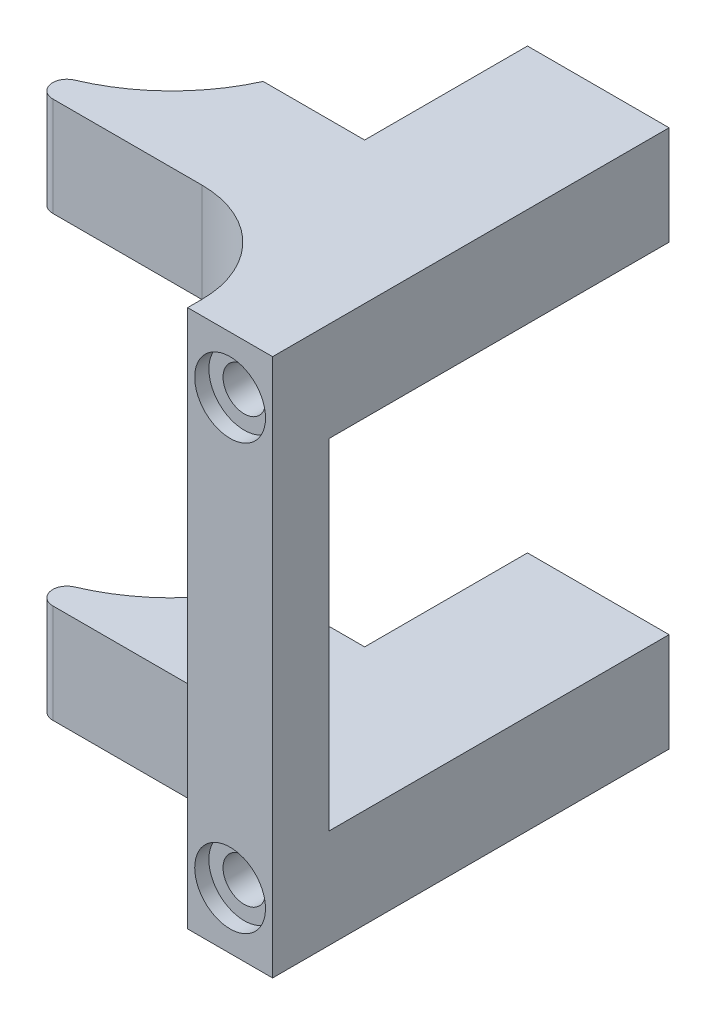
ISO-10303-21;
HEADER;
FILE_DESCRIPTION(('STEP AP214'),'2;1');
FILE_NAME('part.step','',(''),(''),'','','');
FILE_SCHEMA(('AUTOMOTIVE_DESIGN { 1 0 10303 214 1 1 1 1 }'));
ENDSEC;
DATA;
#1=APPLICATION_CONTEXT('core data for automotive mechanical design processes');
#2=APPLICATION_PROTOCOL_DEFINITION('international standard','automotive_design',2000,#1);
#3=PRODUCT_CONTEXT('',#1,'mechanical');
#4=PRODUCT('Part','Part','',(#3));
#5=PRODUCT_RELATED_PRODUCT_CATEGORY('part','',(#4));
#6=PRODUCT_DEFINITION_FORMATION('','',#4);
#7=PRODUCT_DEFINITION_CONTEXT('part definition',#1,'design');
#8=PRODUCT_DEFINITION('design','',#6,#7);
#9=PRODUCT_DEFINITION_SHAPE('','',#8);
#10=(LENGTH_UNIT() NAMED_UNIT(*) SI_UNIT(.MILLI.,.METRE.));
#11=(NAMED_UNIT(*) PLANE_ANGLE_UNIT() SI_UNIT($,.RADIAN.));
#12=(NAMED_UNIT(*) SI_UNIT($,.STERADIAN.) SOLID_ANGLE_UNIT());
#13=UNCERTAINTY_MEASURE_WITH_UNIT(LENGTH_MEASURE(1.E-05),#10,'distance_accuracy_value','');
#14=(GEOMETRIC_REPRESENTATION_CONTEXT(3) GLOBAL_UNCERTAINTY_ASSIGNED_CONTEXT((#13)) GLOBAL_UNIT_ASSIGNED_CONTEXT((#10,
#11,#12)) REPRESENTATION_CONTEXT('',''));
#15=CARTESIAN_POINT('',(0.,0.,0.));
#16=DIRECTION('',(0.,0.,1.));
#17=DIRECTION('',(1.,0.,0.));
#18=AXIS2_PLACEMENT_3D('',#15,#16,#17);
#19=CARTESIAN_POINT('',(2.,34.,-10.));
#20=DIRECTION('',(0.,0.,1.));
#21=DIRECTION('',(1.,0.,0.));
#22=AXIS2_PLACEMENT_3D('',#19,#20,#21);
#23=CYLINDRICAL_SURFACE('',#22,1.5);
#24=CARTESIAN_POINT('',(2.,34.,-10.));
#25=DIRECTION('',(0.,0.,1.));
#26=DIRECTION('',(-1.,0.,0.));
#27=AXIS2_PLACEMENT_3D('',#24,#25,#26);
#28=CIRCLE('',#27,1.5);
#29=CARTESIAN_POINT('',(0.499999999999993,34.,-10.));
#30=VERTEX_POINT('',#29);
#31=EDGE_CURVE('E288',#30,#30,#28,.T.);
#32=ORIENTED_EDGE('',*,*,#31,.F.);
#33=EDGE_LOOP('',(#32));
#34=FACE_BOUND('',#33,.T.);
#35=CARTESIAN_POINT('',(2.,34.,17.));
#36=DIRECTION('',(0.,0.,1.));
#37=DIRECTION('',(1.,0.,0.));
#38=AXIS2_PLACEMENT_3D('',#35,#36,#37);
#39=CIRCLE('',#38,1.5);
#40=CARTESIAN_POINT('',(3.5,34.,17.));
#41=VERTEX_POINT('',#40);
#42=EDGE_CURVE('E41',#41,#41,#39,.F.);
#43=ORIENTED_EDGE('',*,*,#42,.F.);
#44=EDGE_LOOP('',(#43));
#45=FACE_BOUND('',#44,.T.);
#46=ADVANCED_FACE('F37',(#34,#45),#23,.F.);
#47=CARTESIAN_POINT('',(-19.5239351011286,31.,10.));
#48=DIRECTION('',(0.,1.,0.));
#49=DIRECTION('',(0.,0.,1.));
#50=AXIS2_PLACEMENT_3D('',#47,#48,#49);
#51=PLANE('',#50);
#52=DIRECTION('',(1.,0.,0.));
#53=VECTOR('',#52,1.);
#54=CARTESIAN_POINT('',(-1.,31.,14.));
#55=LINE('',#54,#53);
#56=CARTESIAN_POINT('',(-1.67544467966325,31.,14.));
#57=VERTEX_POINT('',#56);
#58=CARTESIAN_POINT('',(5.,31.,14.));
#59=VERTEX_POINT('',#58);
#60=EDGE_CURVE('E54',#57,#59,#55,.T.);
#61=ORIENTED_EDGE('',*,*,#60,.F.);
#62=CARTESIAN_POINT('',(-8.00000000000001,31.,17.));
#63=DIRECTION('',(0.,1.,0.));
#64=DIRECTION('',(0.,0.,1.));
#65=AXIS2_PLACEMENT_3D('',#62,#63,#64);
#66=CIRCLE('',#65,7.);
#67=CARTESIAN_POINT('',(-8.00000000000002,31.,10.));
#68=VERTEX_POINT('',#67);
#69=EDGE_CURVE('E46',#57,#68,#66,.T.);
#70=ORIENTED_EDGE('',*,*,#69,.T.);
#71=DIRECTION('',(1.,0.,0.));
#72=VECTOR('',#71,1.);
#73=CARTESIAN_POINT('',(-19.5239351011286,31.,10.));
#74=LINE('',#73,#72);
#75=CARTESIAN_POINT('',(-18.5239351011286,31.,10.));
#76=VERTEX_POINT('',#75);
#77=EDGE_CURVE('E299',#76,#68,#74,.T.);
#78=ORIENTED_EDGE('',*,*,#77,.F.);
#79=CARTESIAN_POINT('',(-18.5239351011286,31.,9.));
#80=DIRECTION('',(0.,1.,0.));
#81=DIRECTION('',(0.,0.,1.));
#82=AXIS2_PLACEMENT_3D('',#79,#80,#81);
#83=CIRCLE('',#82,1.);
#84=CARTESIAN_POINT('',(-18.9150395410114,31.,8.0796536971857));
#85=VERTEX_POINT('',#84);
#86=EDGE_CURVE('E271',#76,#85,#83,.F.);
#87=ORIENTED_EDGE('',*,*,#86,.T.);
#88=CARTESIAN_POINT('',(-23.999397259488,31.,-3.8848482394002));
#89=DIRECTION('',(0.,1.,0.));
#90=DIRECTION('',(0.,0.,1.));
#91=AXIS2_PLACEMENT_3D('',#88,#89,#90);
#92=CIRCLE('',#91,13.);
#93=CARTESIAN_POINT('',(-12.1670936190878,31.,1.5));
#94=VERTEX_POINT('',#93);
#95=EDGE_CURVE('E267',#85,#94,#92,.T.);
#96=ORIENTED_EDGE('',*,*,#95,.T.);
#97=DIRECTION('',(1.,0.,0.));
#98=VECTOR('',#97,1.);
#99=CARTESIAN_POINT('',(-5.,31.,1.5));
#100=LINE('',#99,#98);
#101=CARTESIAN_POINT('',(-5.,31.,1.5));
#102=VERTEX_POINT('',#101);
#103=EDGE_CURVE('E264',#94,#102,#100,.T.);
#104=ORIENTED_EDGE('',*,*,#103,.T.);
#105=DIRECTION('',(0.,0.,1.));
#106=VECTOR('',#105,1.);
#107=CARTESIAN_POINT('',(-5.,31.,10.));
#108=LINE('',#107,#106);
#109=CARTESIAN_POINT('',(-5.,31.,-10.));
#110=VERTEX_POINT('',#109);
#111=EDGE_CURVE('E292',#110,#102,#108,.T.);
#112=ORIENTED_EDGE('',*,*,#111,.F.);
#113=DIRECTION('',(1.,0.,0.));
#114=VECTOR('',#113,1.);
#115=CARTESIAN_POINT('',(-19.5239351011286,31.,-10.));
#116=LINE('',#115,#114);
#117=CARTESIAN_POINT('',(5.,31.,-10.));
#118=VERTEX_POINT('',#117);
#119=EDGE_CURVE('E266',#110,#118,#116,.T.);
#120=ORIENTED_EDGE('',*,*,#119,.T.);
#121=DIRECTION('',(0.,0.,1.));
#122=VECTOR('',#121,1.);
#123=CARTESIAN_POINT('',(5.,31.,10.));
#124=LINE('',#123,#122);
#125=EDGE_CURVE('E298',#118,#59,#124,.T.);
#126=ORIENTED_EDGE('',*,*,#125,.T.);
#127=EDGE_LOOP('',(#61,#70,#78,#87,#96,#104,#112,#120,#126));
#128=FACE_BOUND('',#127,.T.);
#129=ADVANCED_FACE('F365',(#128),#51,.F.);
#130=CARTESIAN_POINT('',(-5.,38.,10.));
#131=DIRECTION('',(0.,0.,-1.));
#132=DIRECTION('',(-1.,0.,0.));
#133=AXIS2_PLACEMENT_3D('',#130,#131,#132);
#134=PLANE('',#133);
#135=ORIENTED_EDGE('',*,*,#77,.T.);
#136=DIRECTION('',(0.,1.,0.));
#137=VECTOR('',#136,1.);
#138=CARTESIAN_POINT('',(-8.00000000000001,34.5,10.));
#139=LINE('',#138,#137);
#140=CARTESIAN_POINT('',(-8.00000000000001,38.,10.));
#141=VERTEX_POINT('',#140);
#142=EDGE_CURVE('E321',#68,#141,#139,.T.);
#143=ORIENTED_EDGE('',*,*,#142,.T.);
#144=DIRECTION('',(1.,0.,0.));
#145=VECTOR('',#144,1.);
#146=CARTESIAN_POINT('',(-5.,38.,10.));
#147=LINE('',#146,#145);
#148=CARTESIAN_POINT('',(-18.5239351011286,38.,10.));
#149=VERTEX_POINT('',#148);
#150=EDGE_CURVE('E268',#149,#141,#147,.T.);
#151=ORIENTED_EDGE('',*,*,#150,.F.);
#152=DIRECTION('',(0.,-1.,0.));
#153=VECTOR('',#152,1.);
#154=CARTESIAN_POINT('',(-18.5239351011286,54.8283894304178,10.));
#155=LINE('',#154,#153);
#156=EDGE_CURVE('E303',#149,#76,#155,.T.);
#157=ORIENTED_EDGE('',*,*,#156,.T.);
#158=EDGE_LOOP('',(#135,#143,#151,#157));
#159=FACE_BOUND('',#158,.T.);
#160=ADVANCED_FACE('F372',(#159),#134,.F.);
#161=CARTESIAN_POINT('',(-5.,38.,10.));
#162=DIRECTION('',(1.,0.,0.));
#163=DIRECTION('',(0.,0.,-1.));
#164=AXIS2_PLACEMENT_3D('',#161,#162,#163);
#165=PLANE('',#164);
#166=DIRECTION('',(0.,-1.,0.));
#167=VECTOR('',#166,1.);
#168=CARTESIAN_POINT('',(-5.,38.,-10.));
#169=LINE('',#168,#167);
#170=CARTESIAN_POINT('',(-5.,38.,-10.));
#171=VERTEX_POINT('',#170);
#172=EDGE_CURVE('E263',#171,#110,#169,.T.);
#173=ORIENTED_EDGE('',*,*,#172,.T.);
#174=ORIENTED_EDGE('',*,*,#111,.T.);
#175=DIRECTION('',(0.,-1.,0.));
#176=VECTOR('',#175,1.);
#177=CARTESIAN_POINT('',(-5.,54.8283894304178,1.5));
#178=LINE('',#177,#176);
#179=CARTESIAN_POINT('',(-5.,38.,1.5));
#180=VERTEX_POINT('',#179);
#181=EDGE_CURVE('E282',#180,#102,#178,.T.);
#182=ORIENTED_EDGE('',*,*,#181,.F.);
#183=DIRECTION('',(0.,0.,1.));
#184=VECTOR('',#183,1.);
#185=CARTESIAN_POINT('',(-5.,38.,10.));
#186=LINE('',#185,#184);
#187=EDGE_CURVE('E273',#171,#180,#186,.T.);
#188=ORIENTED_EDGE('',*,*,#187,.F.);
#189=EDGE_LOOP('',(#173,#174,#182,#188));
#190=FACE_BOUND('',#189,.T.);
#191=ADVANCED_FACE('F391',(#190),#165,.F.);
#192=CARTESIAN_POINT('',(5.,38.,10.));
#193=DIRECTION('',(-1.,0.,0.));
#194=DIRECTION('',(0.,0.,1.));
#195=AXIS2_PLACEMENT_3D('',#192,#193,#194);
#196=PLANE('',#195);
#197=DIRECTION('',(0.,0.,-1.));
#198=VECTOR('',#197,1.);
#199=CARTESIAN_POINT('',(5.,38.,10.));
#200=LINE('',#199,#198);
#201=CARTESIAN_POINT('',(4.99999999999999,38.,18.));
#202=VERTEX_POINT('',#201);
#203=CARTESIAN_POINT('',(5.,38.,-10.));
#204=VERTEX_POINT('',#203);
#205=EDGE_CURVE('E279',#202,#204,#200,.T.);
#206=ORIENTED_EDGE('',*,*,#205,.F.);
#207=DIRECTION('',(0.,1.,0.));
#208=VECTOR('',#207,1.);
#209=CARTESIAN_POINT('',(4.99999999999999,38.,18.));
#210=LINE('',#209,#208);
#211=CARTESIAN_POINT('',(5.,0.,18.));
#212=VERTEX_POINT('',#211);
#213=EDGE_CURVE('E180',#212,#202,#210,.T.);
#214=ORIENTED_EDGE('',*,*,#213,.F.);
#215=DIRECTION('',(0.,0.,-1.));
#216=VECTOR('',#215,1.);
#217=CARTESIAN_POINT('',(5.,0.,10.));
#218=LINE('',#217,#216);
#219=CARTESIAN_POINT('',(5.,0.,-10.));
#220=VERTEX_POINT('',#219);
#221=EDGE_CURVE('E195',#212,#220,#218,.T.);
#222=ORIENTED_EDGE('',*,*,#221,.T.);
#223=DIRECTION('',(0.,-1.,0.));
#224=VECTOR('',#223,1.);
#225=CARTESIAN_POINT('',(5.,38.,-10.));
#226=LINE('',#225,#224);
#227=CARTESIAN_POINT('',(5.,7.,-10.));
#228=VERTEX_POINT('',#227);
#229=EDGE_CURVE('E250',#228,#220,#226,.T.);
#230=ORIENTED_EDGE('',*,*,#229,.F.);
#231=DIRECTION('',(0.,0.,-1.));
#232=VECTOR('',#231,1.);
#233=CARTESIAN_POINT('',(5.,6.99999999999999,9.99999999999999));
#234=LINE('',#233,#232);
#235=CARTESIAN_POINT('',(5.,6.99999999999999,14.));
#236=VERTEX_POINT('',#235);
#237=EDGE_CURVE('E189',#236,#228,#234,.T.);
#238=ORIENTED_EDGE('',*,*,#237,.F.);
#239=DIRECTION('',(0.,1.,0.));
#240=VECTOR('',#239,1.);
#241=CARTESIAN_POINT('',(5.,-0.211102550927982,14.));
#242=LINE('',#241,#240);
#243=EDGE_CURVE('E255',#236,#59,#242,.T.);
#244=ORIENTED_EDGE('',*,*,#243,.T.);
#245=ORIENTED_EDGE('',*,*,#125,.F.);
#246=DIRECTION('',(0.,-1.,0.));
#247=VECTOR('',#246,1.);
#248=CARTESIAN_POINT('',(5.,38.,-10.));
#249=LINE('',#248,#247);
#250=EDGE_CURVE('E291',#204,#118,#249,.T.);
#251=ORIENTED_EDGE('',*,*,#250,.F.);
#252=EDGE_LOOP('',(#206,#214,#222,#230,#238,#244,#245,#251));
#253=FACE_BOUND('',#252,.T.);
#254=ADVANCED_FACE('F395',(#253),#196,.F.);
#255=CARTESIAN_POINT('',(-5.,38.,-10.));
#256=DIRECTION('',(0.,0.,1.));
#257=DIRECTION('',(1.,0.,0.));
#258=AXIS2_PLACEMENT_3D('',#255,#256,#257);
#259=PLANE('',#258);
#260=ORIENTED_EDGE('',*,*,#31,.T.);
#261=EDGE_LOOP('',(#260));
#262=FACE_BOUND('',#261,.T.);
#263=ORIENTED_EDGE('',*,*,#250,.T.);
#264=ORIENTED_EDGE('',*,*,#119,.F.);
#265=ORIENTED_EDGE('',*,*,#172,.F.);
#266=DIRECTION('',(-1.,0.,0.));
#267=VECTOR('',#266,1.);
#268=CARTESIAN_POINT('',(-5.,38.,-10.));
#269=LINE('',#268,#267);
#270=EDGE_CURVE('E277',#204,#171,#269,.T.);
#271=ORIENTED_EDGE('',*,*,#270,.F.);
#272=EDGE_LOOP('',(#263,#264,#265,#271));
#273=FACE_BOUND('',#272,.T.);
#274=ADVANCED_FACE('F387',(#262,#273),#259,.F.);
#275=CARTESIAN_POINT('',(-23.999397259488,54.8283894304178,-3.8848482394002));
#276=DIRECTION('',(0.,-1.,0.));
#277=DIRECTION('',(0.,0.,-1.));
#278=AXIS2_PLACEMENT_3D('',#275,#276,#277);
#279=CYLINDRICAL_SURFACE('',#278,13.);
#280=ORIENTED_EDGE('',*,*,#95,.F.);
#281=DIRECTION('',(0.,-1.,0.));
#282=VECTOR('',#281,1.);
#283=CARTESIAN_POINT('',(-18.9150395410114,54.8283894304178,8.0796536971857));
#284=LINE('',#283,#282);
#285=CARTESIAN_POINT('',(-18.9150395410114,38.,8.0796536971857));
#286=VERTEX_POINT('',#285);
#287=EDGE_CURVE('E309',#286,#85,#284,.T.);
#288=ORIENTED_EDGE('',*,*,#287,.F.);
#289=CARTESIAN_POINT('',(-23.999397259488,38.,-3.8848482394002));
#290=DIRECTION('',(0.,-1.,0.));
#291=DIRECTION('',(0.,0.,-1.));
#292=AXIS2_PLACEMENT_3D('',#289,#290,#291);
#293=CIRCLE('',#292,13.);
#294=CARTESIAN_POINT('',(-12.1670936190878,38.,1.5));
#295=VERTEX_POINT('',#294);
#296=EDGE_CURVE('E284',#295,#286,#293,.T.);
#297=ORIENTED_EDGE('',*,*,#296,.F.);
#298=DIRECTION('',(0.,-1.,0.));
#299=VECTOR('',#298,1.);
#300=CARTESIAN_POINT('',(-12.1670936190878,54.8283894304178,1.5));
#301=LINE('',#300,#299);
#302=EDGE_CURVE('E302',#295,#94,#301,.T.);
#303=ORIENTED_EDGE('',*,*,#302,.T.);
#304=EDGE_LOOP('',(#280,#288,#297,#303));
#305=FACE_BOUND('',#304,.T.);
#306=ADVANCED_FACE('F380',(#305),#279,.F.);
#307=CARTESIAN_POINT('',(-18.5239351011286,54.8283894304178,9.));
#308=DIRECTION('',(0.,-1.,0.));
#309=DIRECTION('',(0.,0.,-1.));
#310=AXIS2_PLACEMENT_3D('',#307,#308,#309);
#311=CYLINDRICAL_SURFACE('',#310,1.);
#312=ORIENTED_EDGE('',*,*,#86,.F.);
#313=ORIENTED_EDGE('',*,*,#156,.F.);
#314=CARTESIAN_POINT('',(-18.5239351011286,38.,9.));
#315=DIRECTION('',(0.,-1.,0.));
#316=DIRECTION('',(0.,0.,-1.));
#317=AXIS2_PLACEMENT_3D('',#314,#315,#316);
#318=CIRCLE('',#317,1.);
#319=EDGE_CURVE('E272',#286,#149,#318,.F.);
#320=ORIENTED_EDGE('',*,*,#319,.F.);
#321=ORIENTED_EDGE('',*,*,#287,.T.);
#322=EDGE_LOOP('',(#312,#313,#320,#321));
#323=FACE_BOUND('',#322,.T.);
#324=ADVANCED_FACE('F377',(#323),#311,.T.);
#325=CARTESIAN_POINT('',(-5.,54.8283894304178,1.5));
#326=DIRECTION('',(0.,0.,-1.));
#327=DIRECTION('',(-1.,0.,0.));
#328=AXIS2_PLACEMENT_3D('',#325,#326,#327);
#329=PLANE('',#328);
#330=ORIENTED_EDGE('',*,*,#103,.F.);
#331=ORIENTED_EDGE('',*,*,#302,.F.);
#332=DIRECTION('',(-1.,0.,0.));
#333=VECTOR('',#332,1.);
#334=CARTESIAN_POINT('',(-5.,38.,1.5));
#335=LINE('',#334,#333);
#336=EDGE_CURVE('E276',#180,#295,#335,.T.);
#337=ORIENTED_EDGE('',*,*,#336,.F.);
#338=ORIENTED_EDGE('',*,*,#181,.T.);
#339=EDGE_LOOP('',(#330,#331,#337,#338));
#340=FACE_BOUND('',#339,.T.);
#341=ADVANCED_FACE('F359',(#340),#329,.T.);
#342=CARTESIAN_POINT('',(0.,38.,0.));
#343=DIRECTION('',(0.,-1.,0.));
#344=DIRECTION('',(0.,0.,-1.));
#345=AXIS2_PLACEMENT_3D('',#342,#343,#344);
#346=PLANE('',#345);
#347=ORIENTED_EDGE('',*,*,#205,.T.);
#348=ORIENTED_EDGE('',*,*,#270,.T.);
#349=ORIENTED_EDGE('',*,*,#187,.T.);
#350=ORIENTED_EDGE('',*,*,#336,.T.);
#351=ORIENTED_EDGE('',*,*,#296,.T.);
#352=ORIENTED_EDGE('',*,*,#319,.T.);
#353=ORIENTED_EDGE('',*,*,#150,.T.);
#354=CARTESIAN_POINT('',(-8.00000000000001,38.,17.));
#355=DIRECTION('',(0.,-1.,0.));
#356=DIRECTION('',(0.,0.,-1.));
#357=AXIS2_PLACEMENT_3D('',#354,#355,#356);
#358=CIRCLE('',#357,7.);
#359=CARTESIAN_POINT('',(-1.00000000000001,38.,17.));
#360=VERTEX_POINT('',#359);
#361=EDGE_CURVE('E11',#141,#360,#358,.T.);
#362=ORIENTED_EDGE('',*,*,#361,.T.);
#363=DIRECTION('',(0.,0.,-1.));
#364=VECTOR('',#363,1.);
#365=CARTESIAN_POINT('',(-1.00000000000001,38.,18.));
#366=LINE('',#365,#364);
#367=CARTESIAN_POINT('',(-1.00000000000001,38.,18.));
#368=VERTEX_POINT('',#367);
#369=EDGE_CURVE('E261',#368,#360,#366,.T.);
#370=ORIENTED_EDGE('',*,*,#369,.F.);
#371=DIRECTION('',(-1.,0.,0.));
#372=VECTOR('',#371,1.);
#373=CARTESIAN_POINT('',(4.99999999999999,38.,18.));
#374=LINE('',#373,#372);
#375=EDGE_CURVE('E176',#202,#368,#374,.T.);
#376=ORIENTED_EDGE('',*,*,#375,.F.);
#377=EDGE_LOOP('',(#347,#348,#349,#350,#351,#352,#353,#362,#370,#376));
#378=FACE_BOUND('',#377,.T.);
#379=ADVANCED_FACE('F350',(#378),#346,.F.);
#380=CARTESIAN_POINT('',(0.,0.,18.));
#381=DIRECTION('',(0.,0.,1.));
#382=DIRECTION('',(1.,0.,0.));
#383=AXIS2_PLACEMENT_3D('',#380,#381,#382);
#384=PLANE('',#383);
#385=CARTESIAN_POINT('',(1.99999999999999,34.,18.));
#386=DIRECTION('',(0.,0.,1.));
#387=DIRECTION('',(1.,0.,0.));
#388=AXIS2_PLACEMENT_3D('',#385,#386,#387);
#389=CIRCLE('',#388,2.5);
#390=CARTESIAN_POINT('',(4.49999999999999,34.,18.));
#391=VERTEX_POINT('',#390);
#392=EDGE_CURVE('E334',#391,#391,#389,.T.);
#393=ORIENTED_EDGE('',*,*,#392,.F.);
#394=EDGE_LOOP('',(#393));
#395=FACE_BOUND('',#394,.T.);
#396=CARTESIAN_POINT('',(1.99999999999999,4.,18.));
#397=DIRECTION('',(0.,0.,1.));
#398=DIRECTION('',(-1.,0.,0.));
#399=AXIS2_PLACEMENT_3D('',#396,#397,#398);
#400=CIRCLE('',#399,2.5);
#401=CARTESIAN_POINT('',(-0.500000000000013,4.,18.));
#402=VERTEX_POINT('',#401);
#403=EDGE_CURVE('E200',#402,#402,#400,.T.);
#404=ORIENTED_EDGE('',*,*,#403,.F.);
#405=EDGE_LOOP('',(#404));
#406=FACE_BOUND('',#405,.T.);
#407=ORIENTED_EDGE('',*,*,#375,.T.);
#408=DIRECTION('',(0.,-1.,0.));
#409=VECTOR('',#408,1.);
#410=CARTESIAN_POINT('',(-1.00000000000001,38.,18.));
#411=LINE('',#410,#409);
#412=CARTESIAN_POINT('',(-1.,0.,18.));
#413=VERTEX_POINT('',#412);
#414=EDGE_CURVE('E169',#368,#413,#411,.T.);
#415=ORIENTED_EDGE('',*,*,#414,.T.);
#416=DIRECTION('',(1.,0.,0.));
#417=VECTOR('',#416,1.);
#418=CARTESIAN_POINT('',(5.,0.,18.));
#419=LINE('',#418,#417);
#420=EDGE_CURVE('E174',#413,#212,#419,.T.);
#421=ORIENTED_EDGE('',*,*,#420,.T.);
#422=ORIENTED_EDGE('',*,*,#213,.T.);
#423=EDGE_LOOP('',(#407,#415,#421,#422));
#424=FACE_BOUND('',#423,.T.);
#425=ADVANCED_FACE('F171',(#395,#406,#424),#384,.T.);
#426=CARTESIAN_POINT('',(-1.00000000000001,38.,18.));
#427=DIRECTION('',(1.,0.,0.));
#428=DIRECTION('',(0.,0.,-1.));
#429=AXIS2_PLACEMENT_3D('',#426,#427,#428);
#430=PLANE('',#429);
#431=ORIENTED_EDGE('',*,*,#369,.T.);
#432=DIRECTION('',(0.,-1.,0.));
#433=VECTOR('',#432,1.);
#434=CARTESIAN_POINT('',(-1.00000000000001,0.,17.));
#435=LINE('',#434,#433);
#436=CARTESIAN_POINT('',(-1.,0.,17.));
#437=VERTEX_POINT('',#436);
#438=EDGE_CURVE('E187',#360,#437,#435,.T.);
#439=ORIENTED_EDGE('',*,*,#438,.T.);
#440=DIRECTION('',(0.,0.,-1.));
#441=VECTOR('',#440,1.);
#442=CARTESIAN_POINT('',(-1.,0.,18.));
#443=LINE('',#442,#441);
#444=EDGE_CURVE('E184',#413,#437,#443,.T.);
#445=ORIENTED_EDGE('',*,*,#444,.F.);
#446=ORIENTED_EDGE('',*,*,#414,.F.);
#447=EDGE_LOOP('',(#431,#439,#445,#446));
#448=FACE_BOUND('',#447,.T.);
#449=ADVANCED_FACE('F185',(#448),#430,.F.);
#450=CARTESIAN_POINT('',(-1.,-0.211102550927982,14.));
#451=DIRECTION('',(0.,0.,1.));
#452=DIRECTION('',(0.,-1.,0.));
#453=AXIS2_PLACEMENT_3D('',#450,#451,#452);
#454=PLANE('',#453);
#455=DIRECTION('',(1.,0.,0.));
#456=VECTOR('',#455,1.);
#457=CARTESIAN_POINT('',(-1.,6.99999999999999,14.));
#458=LINE('',#457,#456);
#459=CARTESIAN_POINT('',(-1.67544467966325,6.99999999999999,14.));
#460=VERTEX_POINT('',#459);
#461=EDGE_CURVE('E61',#460,#236,#458,.T.);
#462=ORIENTED_EDGE('',*,*,#461,.F.);
#463=DIRECTION('',(0.,1.,0.));
#464=VECTOR('',#463,1.);
#465=CARTESIAN_POINT('',(-1.67544467966325,6.99999999999999,14.));
#466=LINE('',#465,#464);
#467=EDGE_CURVE('E327',#460,#57,#466,.T.);
#468=ORIENTED_EDGE('',*,*,#467,.T.);
#469=ORIENTED_EDGE('',*,*,#60,.T.);
#470=ORIENTED_EDGE('',*,*,#243,.F.);
#471=EDGE_LOOP('',(#462,#468,#469,#470));
#472=FACE_BOUND('',#471,.T.);
#473=ADVANCED_FACE('F357',(#472),#454,.F.);
#474=CARTESIAN_POINT('',(-19.5239351011286,6.99999999999999,9.99999999999999));
#475=DIRECTION('',(0.,-1.,0.));
#476=DIRECTION('',(0.,0.,-1.));
#477=AXIS2_PLACEMENT_3D('',#474,#475,#476);
#478=PLANE('',#477);
#479=DIRECTION('',(1.,0.,0.));
#480=VECTOR('',#479,1.);
#481=CARTESIAN_POINT('',(-19.5239351011286,6.99999999999999,9.99999999999999));
#482=LINE('',#481,#480);
#483=CARTESIAN_POINT('',(-18.5239351011286,6.99999999999999,9.99999999999999));
#484=VERTEX_POINT('',#483);
#485=CARTESIAN_POINT('',(-8.00000000000002,6.99999999999999,9.99999999999999));
#486=VERTEX_POINT('',#485);
#487=EDGE_CURVE('E204',#484,#486,#482,.T.);
#488=ORIENTED_EDGE('',*,*,#487,.T.);
#489=CARTESIAN_POINT('',(-8.00000000000001,6.99999999999999,17.));
#490=DIRECTION('',(0.,-1.,0.));
#491=DIRECTION('',(0.,0.,-1.));
#492=AXIS2_PLACEMENT_3D('',#489,#490,#491);
#493=CIRCLE('',#492,7.);
#494=EDGE_CURVE('E325',#486,#460,#493,.T.);
#495=ORIENTED_EDGE('',*,*,#494,.T.);
#496=ORIENTED_EDGE('',*,*,#461,.T.);
#497=ORIENTED_EDGE('',*,*,#237,.T.);
#498=DIRECTION('',(1.,0.,0.));
#499=VECTOR('',#498,1.);
#500=CARTESIAN_POINT('',(-19.5239351011286,7.,-10.));
#501=LINE('',#500,#499);
#502=CARTESIAN_POINT('',(-5.,7.,-10.));
#503=VERTEX_POINT('',#502);
#504=EDGE_CURVE('E205',#503,#228,#501,.T.);
#505=ORIENTED_EDGE('',*,*,#504,.F.);
#506=DIRECTION('',(0.,0.,-1.));
#507=VECTOR('',#506,1.);
#508=CARTESIAN_POINT('',(-5.,6.99999999999999,10.));
#509=LINE('',#508,#507);
#510=CARTESIAN_POINT('',(-5.,7.00000000000001,1.5));
#511=VERTEX_POINT('',#510);
#512=EDGE_CURVE('E213',#511,#503,#509,.T.);
#513=ORIENTED_EDGE('',*,*,#512,.F.);
#514=DIRECTION('',(-1.,0.,0.));
#515=VECTOR('',#514,1.);
#516=CARTESIAN_POINT('',(-5.,6.99999999999999,1.5));
#517=LINE('',#516,#515);
#518=CARTESIAN_POINT('',(-12.1670936190878,6.99999999999999,1.5));
#519=VERTEX_POINT('',#518);
#520=EDGE_CURVE('E252',#511,#519,#517,.T.);
#521=ORIENTED_EDGE('',*,*,#520,.T.);
#522=CARTESIAN_POINT('',(-23.999397259488,6.99999999999999,-3.8848482394002));
#523=DIRECTION('',(0.,-1.,0.));
#524=DIRECTION('',(0.,0.,-1.));
#525=AXIS2_PLACEMENT_3D('',#522,#523,#524);
#526=CIRCLE('',#525,13.);
#527=CARTESIAN_POINT('',(-18.9150395410114,6.99999999999999,8.0796536971857));
#528=VERTEX_POINT('',#527);
#529=EDGE_CURVE('E208',#519,#528,#526,.T.);
#530=ORIENTED_EDGE('',*,*,#529,.T.);
#531=CARTESIAN_POINT('',(-18.5239351011286,6.99999999999999,9.));
#532=DIRECTION('',(0.,-1.,0.));
#533=DIRECTION('',(0.,0.,-1.));
#534=AXIS2_PLACEMENT_3D('',#531,#532,#533);
#535=CIRCLE('',#534,1.);
#536=EDGE_CURVE('E216',#528,#484,#535,.F.);
#537=ORIENTED_EDGE('',*,*,#536,.T.);
#538=EDGE_LOOP('',(#488,#495,#496,#497,#505,#513,#521,#530,#537));
#539=FACE_BOUND('',#538,.T.);
#540=ADVANCED_FACE('F436',(#539),#478,.F.);
#541=CARTESIAN_POINT('',(-5.,38.,10.));
#542=DIRECTION('',(0.,0.,-1.));
#543=DIRECTION('',(-1.,0.,0.));
#544=AXIS2_PLACEMENT_3D('',#541,#542,#543);
#545=PLANE('',#544);
#546=DIRECTION('',(1.,0.,0.));
#547=VECTOR('',#546,1.);
#548=CARTESIAN_POINT('',(-5.,0.,10.));
#549=LINE('',#548,#547);
#550=CARTESIAN_POINT('',(-18.5239351011286,0.,10.));
#551=VERTEX_POINT('',#550);
#552=CARTESIAN_POINT('',(-8.00000000000001,0.,10.));
#553=VERTEX_POINT('',#552);
#554=EDGE_CURVE('E245',#551,#553,#549,.T.);
#555=ORIENTED_EDGE('',*,*,#554,.T.);
#556=DIRECTION('',(0.,-1.,0.));
#557=VECTOR('',#556,1.);
#558=CARTESIAN_POINT('',(-8.00000000000001,6.99999999999999,10.));
#559=LINE('',#558,#557);
#560=EDGE_CURVE('E319',#553,#486,#559,.F.);
#561=ORIENTED_EDGE('',*,*,#560,.T.);
#562=ORIENTED_EDGE('',*,*,#487,.F.);
#563=DIRECTION('',(0.,-1.,0.));
#564=VECTOR('',#563,1.);
#565=CARTESIAN_POINT('',(-18.5239351011286,54.8283894304178,10.));
#566=LINE('',#565,#564);
#567=EDGE_CURVE('E233',#484,#551,#566,.T.);
#568=ORIENTED_EDGE('',*,*,#567,.T.);
#569=EDGE_LOOP('',(#555,#561,#562,#568));
#570=FACE_BOUND('',#569,.T.);
#571=ADVANCED_FACE('F449',(#570),#545,.F.);
#572=CARTESIAN_POINT('',(2.,4.,-10.));
#573=DIRECTION('',(0.,0.,1.));
#574=DIRECTION('',(1.,0.,0.));
#575=AXIS2_PLACEMENT_3D('',#572,#573,#574);
#576=CYLINDRICAL_SURFACE('',#575,1.5);
#577=CARTESIAN_POINT('',(2.,4.,17.));
#578=DIRECTION('',(0.,0.,-1.));
#579=DIRECTION('',(-1.,0.,0.));
#580=AXIS2_PLACEMENT_3D('',#577,#578,#579);
#581=CIRCLE('',#580,1.5);
#582=CARTESIAN_POINT('',(0.5,4.,17.));
#583=VERTEX_POINT('',#582);
#584=EDGE_CURVE('E198',#583,#583,#581,.F.);
#585=ORIENTED_EDGE('',*,*,#584,.T.);
#586=EDGE_LOOP('',(#585));
#587=FACE_BOUND('',#586,.T.);
#588=CARTESIAN_POINT('',(2.,4.,-10.));
#589=DIRECTION('',(0.,0.,1.));
#590=DIRECTION('',(1.,0.,0.));
#591=AXIS2_PLACEMENT_3D('',#588,#589,#590);
#592=CIRCLE('',#591,1.5);
#593=CARTESIAN_POINT('',(3.5,4.,-10.));
#594=VERTEX_POINT('',#593);
#595=EDGE_CURVE('E218',#594,#594,#592,.T.);
#596=ORIENTED_EDGE('',*,*,#595,.F.);
#597=EDGE_LOOP('',(#596));
#598=FACE_BOUND('',#597,.T.);
#599=ADVANCED_FACE('F462',(#587,#598),#576,.F.);
#600=CARTESIAN_POINT('',(0.,0.,0.));
#601=DIRECTION('',(0.,-1.,0.));
#602=DIRECTION('',(0.,0.,-1.));
#603=AXIS2_PLACEMENT_3D('',#600,#601,#602);
#604=PLANE('',#603);
#605=ORIENTED_EDGE('',*,*,#221,.F.);
#606=ORIENTED_EDGE('',*,*,#420,.F.);
#607=ORIENTED_EDGE('',*,*,#444,.T.);
#608=CARTESIAN_POINT('',(-8.00000000000001,0.,17.));
#609=DIRECTION('',(0.,-1.,0.));
#610=DIRECTION('',(0.,0.,-1.));
#611=AXIS2_PLACEMENT_3D('',#608,#609,#610);
#612=CIRCLE('',#611,7.);
#613=EDGE_CURVE('E323',#437,#553,#612,.F.);
#614=ORIENTED_EDGE('',*,*,#613,.T.);
#615=ORIENTED_EDGE('',*,*,#554,.F.);
#616=CARTESIAN_POINT('',(-18.5239351011286,0.,9.));
#617=DIRECTION('',(0.,-1.,0.));
#618=DIRECTION('',(0.,0.,-1.));
#619=AXIS2_PLACEMENT_3D('',#616,#617,#618);
#620=CIRCLE('',#619,1.);
#621=CARTESIAN_POINT('',(-18.9150395410114,0.,8.0796536971857));
#622=VERTEX_POINT('',#621);
#623=EDGE_CURVE('E227',#551,#622,#620,.T.);
#624=ORIENTED_EDGE('',*,*,#623,.T.);
#625=CARTESIAN_POINT('',(-23.999397259488,0.,-3.8848482394002));
#626=DIRECTION('',(0.,1.,0.));
#627=DIRECTION('',(0.,0.,-1.));
#628=AXIS2_PLACEMENT_3D('',#625,#626,#627);
#629=CIRCLE('',#628,13.);
#630=CARTESIAN_POINT('',(-12.1670936190878,0.,1.5));
#631=VERTEX_POINT('',#630);
#632=EDGE_CURVE('E221',#622,#631,#629,.T.);
#633=ORIENTED_EDGE('',*,*,#632,.T.);
#634=DIRECTION('',(1.,0.,0.));
#635=VECTOR('',#634,1.);
#636=CARTESIAN_POINT('',(-5.,0.,1.5));
#637=LINE('',#636,#635);
#638=CARTESIAN_POINT('',(-5.,0.,1.5));
#639=VERTEX_POINT('',#638);
#640=EDGE_CURVE('E224',#631,#639,#637,.T.);
#641=ORIENTED_EDGE('',*,*,#640,.T.);
#642=DIRECTION('',(0.,0.,1.));
#643=VECTOR('',#642,1.);
#644=CARTESIAN_POINT('',(-5.,0.,10.));
#645=LINE('',#644,#643);
#646=CARTESIAN_POINT('',(-5.,0.,-10.));
#647=VERTEX_POINT('',#646);
#648=EDGE_CURVE('E242',#647,#639,#645,.T.);
#649=ORIENTED_EDGE('',*,*,#648,.F.);
#650=DIRECTION('',(-1.,0.,0.));
#651=VECTOR('',#650,1.);
#652=CARTESIAN_POINT('',(-5.,0.,-10.));
#653=LINE('',#652,#651);
#654=EDGE_CURVE('E239',#220,#647,#653,.T.);
#655=ORIENTED_EDGE('',*,*,#654,.F.);
#656=EDGE_LOOP('',(#605,#606,#607,#614,#615,#624,#633,#641,#649,#655));
#657=FACE_BOUND('',#656,.T.);
#658=ADVANCED_FACE('F192',(#657),#604,.T.);
#659=CARTESIAN_POINT('',(-18.5239351011286,54.8283894304178,9.));
#660=DIRECTION('',(0.,-1.,0.));
#661=DIRECTION('',(0.,0.,-1.));
#662=AXIS2_PLACEMENT_3D('',#659,#660,#661);
#663=CYLINDRICAL_SURFACE('',#662,1.);
#664=ORIENTED_EDGE('',*,*,#536,.F.);
#665=DIRECTION('',(0.,-1.,0.));
#666=VECTOR('',#665,1.);
#667=CARTESIAN_POINT('',(-18.9150395410114,54.8283894304178,8.0796536971857));
#668=LINE('',#667,#666);
#669=EDGE_CURVE('E231',#528,#622,#668,.T.);
#670=ORIENTED_EDGE('',*,*,#669,.T.);
#671=ORIENTED_EDGE('',*,*,#623,.F.);
#672=ORIENTED_EDGE('',*,*,#567,.F.);
#673=EDGE_LOOP('',(#664,#670,#671,#672));
#674=FACE_BOUND('',#673,.T.);
#675=ADVANCED_FACE('F453',(#674),#663,.T.);
#676=CARTESIAN_POINT('',(-5.,54.8283894304178,1.5));
#677=DIRECTION('',(0.,0.,-1.));
#678=DIRECTION('',(-1.,0.,0.));
#679=AXIS2_PLACEMENT_3D('',#676,#677,#678);
#680=PLANE('',#679);
#681=ORIENTED_EDGE('',*,*,#520,.F.);
#682=DIRECTION('',(0.,-1.,0.));
#683=VECTOR('',#682,1.);
#684=CARTESIAN_POINT('',(-5.,54.8283894304178,1.5));
#685=LINE('',#684,#683);
#686=EDGE_CURVE('E235',#511,#639,#685,.T.);
#687=ORIENTED_EDGE('',*,*,#686,.T.);
#688=ORIENTED_EDGE('',*,*,#640,.F.);
#689=DIRECTION('',(0.,-1.,0.));
#690=VECTOR('',#689,1.);
#691=CARTESIAN_POINT('',(-12.1670936190878,54.8283894304178,1.5));
#692=LINE('',#691,#690);
#693=EDGE_CURVE('E230',#519,#631,#692,.T.);
#694=ORIENTED_EDGE('',*,*,#693,.F.);
#695=EDGE_LOOP('',(#681,#687,#688,#694));
#696=FACE_BOUND('',#695,.T.);
#697=ADVANCED_FACE('F440',(#696),#680,.T.);
#698=CARTESIAN_POINT('',(-23.999397259488,54.8283894304178,-3.8848482394002));
#699=DIRECTION('',(0.,-1.,0.));
#700=DIRECTION('',(0.,0.,-1.));
#701=AXIS2_PLACEMENT_3D('',#698,#699,#700);
#702=CYLINDRICAL_SURFACE('',#701,13.);
#703=ORIENTED_EDGE('',*,*,#529,.F.);
#704=ORIENTED_EDGE('',*,*,#693,.T.);
#705=ORIENTED_EDGE('',*,*,#632,.F.);
#706=ORIENTED_EDGE('',*,*,#669,.F.);
#707=EDGE_LOOP('',(#703,#704,#705,#706));
#708=FACE_BOUND('',#707,.T.);
#709=ADVANCED_FACE('F443',(#708),#702,.F.);
#710=CARTESIAN_POINT('',(-5.,38.,-10.));
#711=DIRECTION('',(0.,0.,1.));
#712=DIRECTION('',(1.,0.,0.));
#713=AXIS2_PLACEMENT_3D('',#710,#711,#712);
#714=PLANE('',#713);
#715=ORIENTED_EDGE('',*,*,#595,.T.);
#716=EDGE_LOOP('',(#715));
#717=FACE_BOUND('',#716,.T.);
#718=DIRECTION('',(0.,-1.,0.));
#719=VECTOR('',#718,1.);
#720=CARTESIAN_POINT('',(-5.,38.,-10.));
#721=LINE('',#720,#719);
#722=EDGE_CURVE('E248',#503,#647,#721,.T.);
#723=ORIENTED_EDGE('',*,*,#722,.F.);
#724=ORIENTED_EDGE('',*,*,#504,.T.);
#725=ORIENTED_EDGE('',*,*,#229,.T.);
#726=ORIENTED_EDGE('',*,*,#654,.T.);
#727=EDGE_LOOP('',(#723,#724,#725,#726));
#728=FACE_BOUND('',#727,.T.);
#729=ADVANCED_FACE('F428',(#717,#728),#714,.F.);
#730=CARTESIAN_POINT('',(-5.,38.,10.));
#731=DIRECTION('',(1.,0.,0.));
#732=DIRECTION('',(0.,0.,-1.));
#733=AXIS2_PLACEMENT_3D('',#730,#731,#732);
#734=PLANE('',#733);
#735=ORIENTED_EDGE('',*,*,#686,.F.);
#736=ORIENTED_EDGE('',*,*,#512,.T.);
#737=ORIENTED_EDGE('',*,*,#722,.T.);
#738=ORIENTED_EDGE('',*,*,#648,.T.);
#739=EDGE_LOOP('',(#735,#736,#737,#738));
#740=FACE_BOUND('',#739,.T.);
#741=ADVANCED_FACE('F433',(#740),#734,.F.);
#742=CARTESIAN_POINT('',(-8.00000000000001,38.,17.));
#743=DIRECTION('',(0.,1.,0.));
#744=DIRECTION('',(0.,0.,1.));
#745=AXIS2_PLACEMENT_3D('',#742,#743,#744);
#746=CYLINDRICAL_SURFACE('',#745,7.);
#747=ORIENTED_EDGE('',*,*,#494,.F.);
#748=ORIENTED_EDGE('',*,*,#560,.F.);
#749=ORIENTED_EDGE('',*,*,#613,.F.);
#750=ORIENTED_EDGE('',*,*,#438,.F.);
#751=ORIENTED_EDGE('',*,*,#361,.F.);
#752=ORIENTED_EDGE('',*,*,#142,.F.);
#753=ORIENTED_EDGE('',*,*,#69,.F.);
#754=ORIENTED_EDGE('',*,*,#467,.F.);
#755=EDGE_LOOP('',(#747,#748,#749,#750,#751,#752,#753,#754));
#756=FACE_BOUND('',#755,.T.);
#757=ADVANCED_FACE('F39',(#756),#746,.F.);
#758=CARTESIAN_POINT('',(1.99999999999999,4.,17.));
#759=DIRECTION('',(0.,0.,-1.));
#760=DIRECTION('',(-1.,0.,0.));
#761=AXIS2_PLACEMENT_3D('',#758,#759,#760);
#762=PLANE('',#761);
#763=CARTESIAN_POINT('',(1.99999999999999,4.,17.));
#764=DIRECTION('',(0.,0.,1.));
#765=DIRECTION('',(-1.,0.,0.));
#766=AXIS2_PLACEMENT_3D('',#763,#764,#765);
#767=CIRCLE('',#766,2.5);
#768=CARTESIAN_POINT('',(-0.500000000000013,4.,17.));
#769=VERTEX_POINT('',#768);
#770=EDGE_CURVE('E339',#769,#769,#767,.T.);
#771=ORIENTED_EDGE('',*,*,#770,.T.);
#772=EDGE_LOOP('',(#771));
#773=FACE_BOUND('',#772,.T.);
#774=ORIENTED_EDGE('',*,*,#584,.F.);
#775=EDGE_LOOP('',(#774));
#776=FACE_BOUND('',#775,.T.);
#777=ADVANCED_FACE('F486',(#773,#776),#762,.F.);
#778=CARTESIAN_POINT('',(1.99999999999999,4.,17.));
#779=DIRECTION('',(0.,0.,1.));
#780=DIRECTION('',(1.,0.,0.));
#781=AXIS2_PLACEMENT_3D('',#778,#779,#780);
#782=CYLINDRICAL_SURFACE('',#781,2.5);
#783=ORIENTED_EDGE('',*,*,#770,.F.);
#784=EDGE_LOOP('',(#783));
#785=FACE_BOUND('',#784,.T.);
#786=ORIENTED_EDGE('',*,*,#403,.T.);
#787=EDGE_LOOP('',(#786));
#788=FACE_BOUND('',#787,.T.);
#789=ADVANCED_FACE('F347',(#785,#788),#782,.F.);
#790=CARTESIAN_POINT('',(1.99999999999999,34.,17.));
#791=DIRECTION('',(0.,0.,1.));
#792=DIRECTION('',(1.,0.,0.));
#793=AXIS2_PLACEMENT_3D('',#790,#791,#792);
#794=PLANE('',#793);
#795=CARTESIAN_POINT('',(1.99999999999999,34.,17.));
#796=DIRECTION('',(0.,0.,1.));
#797=DIRECTION('',(1.,0.,0.));
#798=AXIS2_PLACEMENT_3D('',#795,#796,#797);
#799=CIRCLE('',#798,2.5);
#800=CARTESIAN_POINT('',(4.49999999999999,34.,17.));
#801=VERTEX_POINT('',#800);
#802=EDGE_CURVE('E330',#801,#801,#799,.T.);
#803=ORIENTED_EDGE('',*,*,#802,.T.);
#804=EDGE_LOOP('',(#803));
#805=FACE_BOUND('',#804,.T.);
#806=ORIENTED_EDGE('',*,*,#42,.T.);
#807=EDGE_LOOP('',(#806));
#808=FACE_BOUND('',#807,.T.);
#809=ADVANCED_FACE('F485',(#805,#808),#794,.T.);
#810=CARTESIAN_POINT('',(1.99999999999999,34.,17.));
#811=DIRECTION('',(0.,0.,1.));
#812=DIRECTION('',(1.,0.,0.));
#813=AXIS2_PLACEMENT_3D('',#810,#811,#812);
#814=CYLINDRICAL_SURFACE('',#813,2.5);
#815=ORIENTED_EDGE('',*,*,#802,.F.);
#816=EDGE_LOOP('',(#815));
#817=FACE_BOUND('',#816,.T.);
#818=ORIENTED_EDGE('',*,*,#392,.T.);
#819=EDGE_LOOP('',(#818));
#820=FACE_BOUND('',#819,.T.);
#821=ADVANCED_FACE('F490',(#817,#820),#814,.F.);
#822=CLOSED_SHELL('',(#46,#129,#160,#191,#254,#274,#306,#324,#341,#379,#425,#449,#473,#540,#571,
#599,#658,#675,#697,#709,#729,#741,#757,#777,#789,#809,#821));
#823=MANIFOLD_SOLID_BREP('B2',#822);
#824=ADVANCED_BREP_SHAPE_REPRESENTATION('',(#18,#823),#14);
#825=SHAPE_DEFINITION_REPRESENTATION(#9,#824);
ENDSEC;
END-ISO-10303-21;
